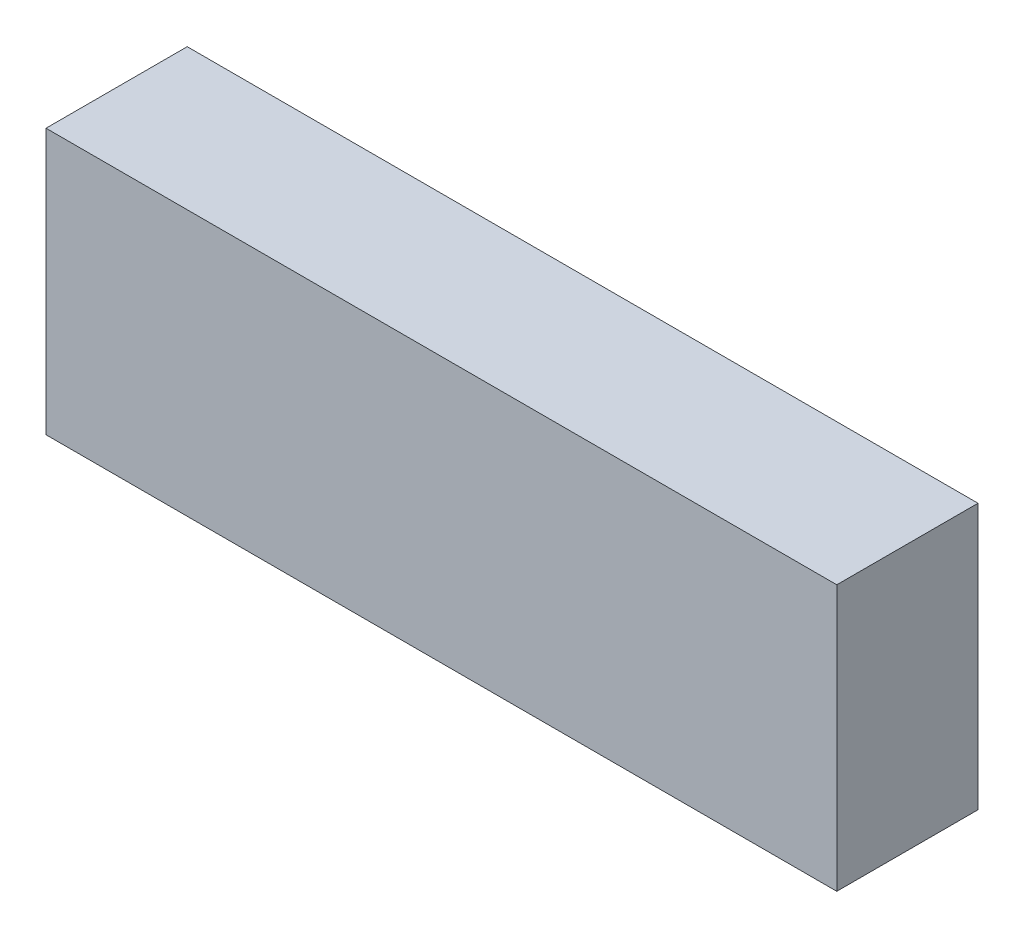
ISO-10303-21;
HEADER;
FILE_DESCRIPTION(('STEP AP214'),'2;1');
FILE_NAME('part.step','',(''),(''),'','','');
FILE_SCHEMA(('AUTOMOTIVE_DESIGN { 1 0 10303 214 1 1 1 1 }'));
ENDSEC;
DATA;
#1=APPLICATION_CONTEXT('core data for automotive mechanical design processes');
#2=APPLICATION_PROTOCOL_DEFINITION('international standard','automotive_design',2000,#1);
#3=PRODUCT_CONTEXT('',#1,'mechanical');
#4=PRODUCT('Part','Part','',(#3));
#5=PRODUCT_RELATED_PRODUCT_CATEGORY('part','',(#4));
#6=PRODUCT_DEFINITION_FORMATION('','',#4);
#7=PRODUCT_DEFINITION_CONTEXT('part definition',#1,'design');
#8=PRODUCT_DEFINITION('design','',#6,#7);
#9=PRODUCT_DEFINITION_SHAPE('','',#8);
#10=(LENGTH_UNIT() NAMED_UNIT(*) SI_UNIT(.MILLI.,.METRE.));
#11=(NAMED_UNIT(*) PLANE_ANGLE_UNIT() SI_UNIT($,.RADIAN.));
#12=(NAMED_UNIT(*) SI_UNIT($,.STERADIAN.) SOLID_ANGLE_UNIT());
#13=UNCERTAINTY_MEASURE_WITH_UNIT(LENGTH_MEASURE(1.E-05),#10,'distance_accuracy_value','');
#14=(GEOMETRIC_REPRESENTATION_CONTEXT(3) GLOBAL_UNCERTAINTY_ASSIGNED_CONTEXT((#13)) GLOBAL_UNIT_ASSIGNED_CONTEXT((#10,
#11,#12)) REPRESENTATION_CONTEXT('',''));
#15=CARTESIAN_POINT('',(0.,0.,0.));
#16=DIRECTION('',(0.,0.,1.));
#17=DIRECTION('',(1.,0.,0.));
#18=AXIS2_PLACEMENT_3D('',#15,#16,#17);
#19=CARTESIAN_POINT('',(70.,23.5,25.));
#20=DIRECTION('',(-1.,0.,0.));
#21=DIRECTION('',(0.,0.,1.));
#22=AXIS2_PLACEMENT_3D('',#19,#20,#21);
#23=PLANE('',#22);
#24=DIRECTION('',(0.,1.,0.));
#25=VECTOR('',#24,1.);
#26=CARTESIAN_POINT('',(70.,23.5,0.));
#27=LINE('',#26,#25);
#28=CARTESIAN_POINT('',(70.,-23.5,0.));
#29=VERTEX_POINT('',#28);
#30=CARTESIAN_POINT('',(70.,23.5,0.));
#31=VERTEX_POINT('',#30);
#32=EDGE_CURVE('E113',#29,#31,#27,.T.);
#33=ORIENTED_EDGE('',*,*,#32,.T.);
#34=DIRECTION('',(0.,0.,-1.));
#35=VECTOR('',#34,1.);
#36=CARTESIAN_POINT('',(70.,23.5,25.));
#37=LINE('',#36,#35);
#38=CARTESIAN_POINT('',(70.,23.5,25.));
#39=VERTEX_POINT('',#38);
#40=EDGE_CURVE('E11',#39,#31,#37,.T.);
#41=ORIENTED_EDGE('',*,*,#40,.F.);
#42=DIRECTION('',(0.,1.,0.));
#43=VECTOR('',#42,1.);
#44=CARTESIAN_POINT('',(70.,23.5,25.));
#45=LINE('',#44,#43);
#46=CARTESIAN_POINT('',(70.,-23.5,25.));
#47=VERTEX_POINT('',#46);
#48=EDGE_CURVE('E97',#47,#39,#45,.T.);
#49=ORIENTED_EDGE('',*,*,#48,.F.);
#50=DIRECTION('',(0.,0.,-1.));
#51=VECTOR('',#50,1.);
#52=CARTESIAN_POINT('',(70.,-23.5,25.));
#53=LINE('',#52,#51);
#54=EDGE_CURVE('E109',#47,#29,#53,.T.);
#55=ORIENTED_EDGE('',*,*,#54,.T.);
#56=EDGE_LOOP('',(#33,#41,#49,#55));
#57=FACE_BOUND('',#56,.T.);
#58=ADVANCED_FACE('F45',(#57),#23,.F.);
#59=CARTESIAN_POINT('',(-70.,23.5,25.));
#60=DIRECTION('',(0.,-1.,0.));
#61=DIRECTION('',(0.,0.,-1.));
#62=AXIS2_PLACEMENT_3D('',#59,#60,#61);
#63=PLANE('',#62);
#64=DIRECTION('',(-1.,0.,0.));
#65=VECTOR('',#64,1.);
#66=CARTESIAN_POINT('',(-70.,23.5,0.));
#67=LINE('',#66,#65);
#68=CARTESIAN_POINT('',(-70.,23.5,0.));
#69=VERTEX_POINT('',#68);
#70=EDGE_CURVE('E102',#31,#69,#67,.T.);
#71=ORIENTED_EDGE('',*,*,#70,.T.);
#72=DIRECTION('',(0.,0.,-1.));
#73=VECTOR('',#72,1.);
#74=CARTESIAN_POINT('',(-70.,23.5,25.));
#75=LINE('',#74,#73);
#76=CARTESIAN_POINT('',(-70.,23.5,25.));
#77=VERTEX_POINT('',#76);
#78=EDGE_CURVE('E54',#77,#69,#75,.T.);
#79=ORIENTED_EDGE('',*,*,#78,.F.);
#80=DIRECTION('',(-1.,0.,0.));
#81=VECTOR('',#80,1.);
#82=CARTESIAN_POINT('',(-70.,23.5,25.));
#83=LINE('',#82,#81);
#84=EDGE_CURVE('E92',#39,#77,#83,.T.);
#85=ORIENTED_EDGE('',*,*,#84,.F.);
#86=ORIENTED_EDGE('',*,*,#40,.T.);
#87=EDGE_LOOP('',(#71,#79,#85,#86));
#88=FACE_BOUND('',#87,.T.);
#89=ADVANCED_FACE('F101',(#88),#63,.F.);
#90=CARTESIAN_POINT('',(-70.,23.5,25.));
#91=DIRECTION('',(1.,0.,0.));
#92=DIRECTION('',(0.,1.,0.));
#93=AXIS2_PLACEMENT_3D('',#90,#91,#92);
#94=PLANE('',#93);
#95=DIRECTION('',(0.,-1.,0.));
#96=VECTOR('',#95,1.);
#97=CARTESIAN_POINT('',(-70.,23.5,0.));
#98=LINE('',#97,#96);
#99=CARTESIAN_POINT('',(-70.,-23.5,0.));
#100=VERTEX_POINT('',#99);
#101=EDGE_CURVE('E79',#69,#100,#98,.T.);
#102=ORIENTED_EDGE('',*,*,#101,.T.);
#103=DIRECTION('',(0.,0.,-1.));
#104=VECTOR('',#103,1.);
#105=CARTESIAN_POINT('',(-70.,-23.5,25.));
#106=LINE('',#105,#104);
#107=CARTESIAN_POINT('',(-70.,-23.5,25.));
#108=VERTEX_POINT('',#107);
#109=EDGE_CURVE('E104',#108,#100,#106,.T.);
#110=ORIENTED_EDGE('',*,*,#109,.F.);
#111=DIRECTION('',(0.,-1.,0.));
#112=VECTOR('',#111,1.);
#113=CARTESIAN_POINT('',(-70.,23.5,25.));
#114=LINE('',#113,#112);
#115=EDGE_CURVE('E95',#77,#108,#114,.T.);
#116=ORIENTED_EDGE('',*,*,#115,.F.);
#117=ORIENTED_EDGE('',*,*,#78,.T.);
#118=EDGE_LOOP('',(#102,#110,#116,#117));
#119=FACE_BOUND('',#118,.T.);
#120=ADVANCED_FACE('F105',(#119),#94,.F.);
#121=CARTESIAN_POINT('',(-70.,-23.5,25.));
#122=DIRECTION('',(0.,1.,0.));
#123=DIRECTION('',(0.,0.,1.));
#124=AXIS2_PLACEMENT_3D('',#121,#122,#123);
#125=PLANE('',#124);
#126=DIRECTION('',(1.,0.,0.));
#127=VECTOR('',#126,1.);
#128=CARTESIAN_POINT('',(-70.,-23.5,0.));
#129=LINE('',#128,#127);
#130=EDGE_CURVE('E85',#100,#29,#129,.T.);
#131=ORIENTED_EDGE('',*,*,#130,.T.);
#132=ORIENTED_EDGE('',*,*,#54,.F.);
#133=DIRECTION('',(1.,0.,0.));
#134=VECTOR('',#133,1.);
#135=CARTESIAN_POINT('',(-70.,-23.5,25.));
#136=LINE('',#135,#134);
#137=EDGE_CURVE('E62',#108,#47,#136,.T.);
#138=ORIENTED_EDGE('',*,*,#137,.F.);
#139=ORIENTED_EDGE('',*,*,#109,.T.);
#140=EDGE_LOOP('',(#131,#132,#138,#139));
#141=FACE_BOUND('',#140,.T.);
#142=ADVANCED_FACE('F126',(#141),#125,.F.);
#143=CARTESIAN_POINT('',(0.,0.,25.));
#144=DIRECTION('',(0.,0.,1.));
#145=DIRECTION('',(1.,0.,0.));
#146=AXIS2_PLACEMENT_3D('',#143,#144,#145);
#147=PLANE('',#146);
#148=ORIENTED_EDGE('',*,*,#48,.T.);
#149=ORIENTED_EDGE('',*,*,#84,.T.);
#150=ORIENTED_EDGE('',*,*,#115,.T.);
#151=ORIENTED_EDGE('',*,*,#137,.T.);
#152=EDGE_LOOP('',(#148,#149,#150,#151));
#153=FACE_BOUND('',#152,.T.);
#154=ADVANCED_FACE('F93',(#153),#147,.T.);
#155=CARTESIAN_POINT('',(0.,0.,0.));
#156=DIRECTION('',(0.,0.,1.));
#157=DIRECTION('',(1.,0.,0.));
#158=AXIS2_PLACEMENT_3D('',#155,#156,#157);
#159=PLANE('',#158);
#160=ORIENTED_EDGE('',*,*,#32,.F.);
#161=ORIENTED_EDGE('',*,*,#130,.F.);
#162=ORIENTED_EDGE('',*,*,#101,.F.);
#163=ORIENTED_EDGE('',*,*,#70,.F.);
#164=EDGE_LOOP('',(#160,#161,#162,#163));
#165=FACE_BOUND('',#164,.T.);
#166=ADVANCED_FACE('F129',(#165),#159,.F.);
#167=CLOSED_SHELL('',(#58,#89,#120,#142,#154,#166));
#168=MANIFOLD_SOLID_BREP('B2',#167);
#169=ADVANCED_BREP_SHAPE_REPRESENTATION('',(#18,#168),#14);
#170=SHAPE_DEFINITION_REPRESENTATION(#9,#169);
ENDSEC;
END-ISO-10303-21;
